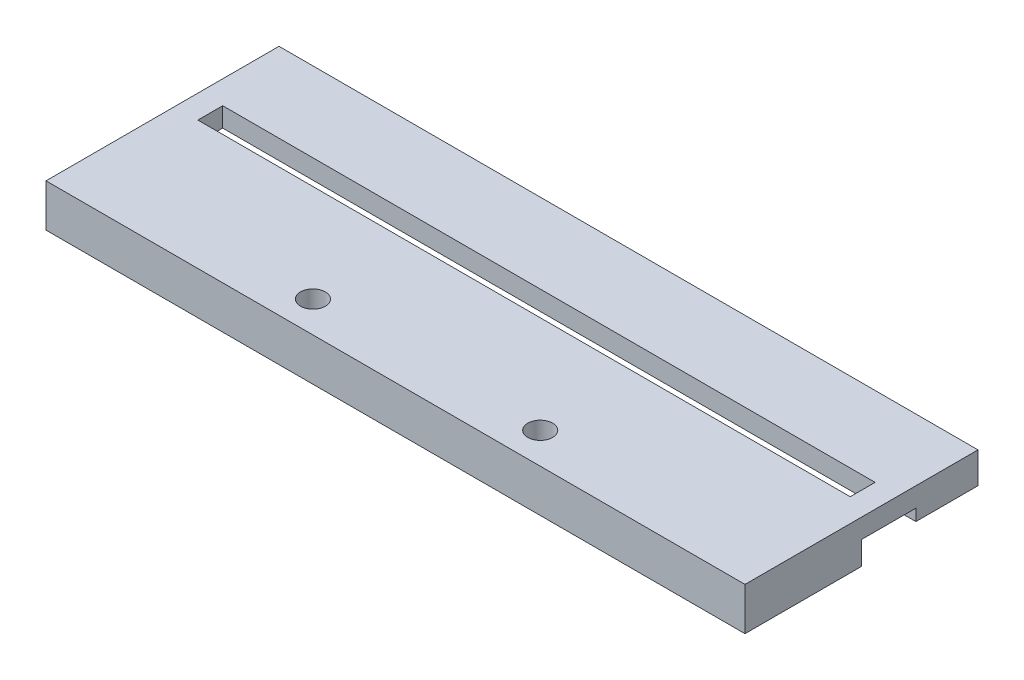
ISO-10303-21;
HEADER;
FILE_DESCRIPTION(('STEP AP214'),'2;1');
FILE_NAME('part.step','',(''),(''),'','','');
FILE_SCHEMA(('AUTOMOTIVE_DESIGN { 1 0 10303 214 1 1 1 1 }'));
ENDSEC;
DATA;
#1=APPLICATION_CONTEXT('core data for automotive mechanical design processes');
#2=APPLICATION_PROTOCOL_DEFINITION('international standard','automotive_design',2000,#1);
#3=PRODUCT_CONTEXT('',#1,'mechanical');
#4=PRODUCT('Part','Part','',(#3));
#5=PRODUCT_RELATED_PRODUCT_CATEGORY('part','',(#4));
#6=PRODUCT_DEFINITION_FORMATION('','',#4);
#7=PRODUCT_DEFINITION_CONTEXT('part definition',#1,'design');
#8=PRODUCT_DEFINITION('design','',#6,#7);
#9=PRODUCT_DEFINITION_SHAPE('','',#8);
#10=(LENGTH_UNIT() NAMED_UNIT(*) SI_UNIT(.MILLI.,.METRE.));
#11=(NAMED_UNIT(*) PLANE_ANGLE_UNIT() SI_UNIT($,.RADIAN.));
#12=(NAMED_UNIT(*) SI_UNIT($,.STERADIAN.) SOLID_ANGLE_UNIT());
#13=UNCERTAINTY_MEASURE_WITH_UNIT(LENGTH_MEASURE(1.E-05),#10,'distance_accuracy_value','');
#14=(GEOMETRIC_REPRESENTATION_CONTEXT(3) GLOBAL_UNCERTAINTY_ASSIGNED_CONTEXT((#13)) GLOBAL_UNIT_ASSIGNED_CONTEXT((#10,
#11,#12)) REPRESENTATION_CONTEXT('',''));
#15=CARTESIAN_POINT('',(0.,0.,0.));
#16=DIRECTION('',(0.,0.,1.));
#17=DIRECTION('',(1.,0.,0.));
#18=AXIS2_PLACEMENT_3D('',#15,#16,#17);
#19=CARTESIAN_POINT('',(0.,1.5,0.));
#20=DIRECTION('',(0.,1.,0.));
#21=DIRECTION('',(0.,0.,1.));
#22=AXIS2_PLACEMENT_3D('',#19,#20,#21);
#23=PLANE('',#22);
#24=DIRECTION('',(0.,0.,-1.));
#25=VECTOR('',#24,1.);
#26=CARTESIAN_POINT('',(-45.,1.5,-10.));
#27=LINE('',#26,#25);
#28=CARTESIAN_POINT('',(-45.,1.50000000000003,-7.));
#29=VERTEX_POINT('',#28);
#30=CARTESIAN_POINT('',(-45.,1.5,-15.));
#31=VERTEX_POINT('',#30);
#32=EDGE_CURVE('E283',#29,#31,#27,.T.);
#33=ORIENTED_EDGE('',*,*,#32,.T.);
#34=DIRECTION('',(1.,0.,0.));
#35=VECTOR('',#34,1.);
#36=CARTESIAN_POINT('',(45.,1.5,-15.));
#37=LINE('',#36,#35);
#38=CARTESIAN_POINT('',(-42.5,1.5,-15.));
#39=VERTEX_POINT('',#38);
#40=EDGE_CURVE('E202',#31,#39,#37,.T.);
#41=ORIENTED_EDGE('',*,*,#40,.T.);
#42=DIRECTION('',(0.,0.,1.));
#43=VECTOR('',#42,1.);
#44=CARTESIAN_POINT('',(-42.5,1.5,0.));
#45=LINE('',#44,#43);
#46=CARTESIAN_POINT('',(-42.5,1.5,-7.));
#47=VERTEX_POINT('',#46);
#48=EDGE_CURVE('E11',#39,#47,#45,.T.);
#49=ORIENTED_EDGE('',*,*,#48,.T.);
#50=DIRECTION('',(-1.,0.,0.));
#51=VECTOR('',#50,1.);
#52=CARTESIAN_POINT('',(-45.,1.5,-7.));
#53=LINE('',#52,#51);
#54=EDGE_CURVE('E280',#47,#29,#53,.T.);
#55=ORIENTED_EDGE('',*,*,#54,.T.);
#56=EDGE_LOOP('',(#33,#41,#49,#55));
#57=FACE_BOUND('',#56,.T.);
#58=ADVANCED_FACE('F39',(#57),#23,.F.);
#59=CARTESIAN_POINT('',(45.,5.5,15.));
#60=DIRECTION('',(-1.,0.,0.));
#61=DIRECTION('',(0.,0.,1.));
#62=AXIS2_PLACEMENT_3D('',#59,#60,#61);
#63=PLANE('',#62);
#64=DIRECTION('',(0.,0.,1.));
#65=VECTOR('',#64,1.);
#66=CARTESIAN_POINT('',(45.,3.,0.));
#67=LINE('',#66,#65);
#68=CARTESIAN_POINT('',(45.,3.00000000000003,-7.));
#69=VERTEX_POINT('',#68);
#70=CARTESIAN_POINT('',(45.,3.,0.));
#71=VERTEX_POINT('',#70);
#72=EDGE_CURVE('E159',#69,#71,#67,.T.);
#73=ORIENTED_EDGE('',*,*,#72,.F.);
#74=DIRECTION('',(0.,-1.,0.));
#75=VECTOR('',#74,1.);
#76=CARTESIAN_POINT('',(45.,93.27181176868,-7.));
#77=LINE('',#76,#75);
#78=CARTESIAN_POINT('',(45.,1.50000000000003,-7.));
#79=VERTEX_POINT('',#78);
#80=EDGE_CURVE('E170',#69,#79,#77,.T.);
#81=ORIENTED_EDGE('',*,*,#80,.T.);
#82=DIRECTION('',(0.,0.,1.));
#83=VECTOR('',#82,1.);
#84=CARTESIAN_POINT('',(45.,1.5,-10.));
#85=LINE('',#84,#83);
#86=CARTESIAN_POINT('',(45.,1.5,-15.));
#87=VERTEX_POINT('',#86);
#88=EDGE_CURVE('E275',#87,#79,#85,.T.);
#89=ORIENTED_EDGE('',*,*,#88,.F.);
#90=DIRECTION('',(0.,-1.,0.));
#91=VECTOR('',#90,1.);
#92=CARTESIAN_POINT('',(45.,5.5,-15.));
#93=LINE('',#92,#91);
#94=CARTESIAN_POINT('',(45.,5.5,-15.));
#95=VERTEX_POINT('',#94);
#96=EDGE_CURVE('E320',#95,#87,#93,.T.);
#97=ORIENTED_EDGE('',*,*,#96,.F.);
#98=DIRECTION('',(0.,0.,-1.));
#99=VECTOR('',#98,1.);
#100=CARTESIAN_POINT('',(45.,5.5,15.));
#101=LINE('',#100,#99);
#102=CARTESIAN_POINT('',(45.,5.5,15.));
#103=VERTEX_POINT('',#102);
#104=EDGE_CURVE('E287',#103,#95,#101,.T.);
#105=ORIENTED_EDGE('',*,*,#104,.F.);
#106=DIRECTION('',(0.,-1.,0.));
#107=VECTOR('',#106,1.);
#108=CARTESIAN_POINT('',(45.,5.5,15.));
#109=LINE('',#108,#107);
#110=CARTESIAN_POINT('',(45.,0.,15.));
#111=VERTEX_POINT('',#110);
#112=EDGE_CURVE('E301',#103,#111,#109,.T.);
#113=ORIENTED_EDGE('',*,*,#112,.T.);
#114=DIRECTION('',(0.,0.,-1.));
#115=VECTOR('',#114,1.);
#116=CARTESIAN_POINT('',(45.,0.,15.));
#117=LINE('',#116,#115);
#118=CARTESIAN_POINT('',(45.,0.,0.));
#119=VERTEX_POINT('',#118);
#120=EDGE_CURVE('E286',#111,#119,#117,.T.);
#121=ORIENTED_EDGE('',*,*,#120,.T.);
#122=DIRECTION('',(0.,-1.,0.));
#123=VECTOR('',#122,1.);
#124=CARTESIAN_POINT('',(45.,93.27181176868,0.));
#125=LINE('',#124,#123);
#126=EDGE_CURVE('E179',#71,#119,#125,.T.);
#127=ORIENTED_EDGE('',*,*,#126,.F.);
#128=EDGE_LOOP('',(#73,#81,#89,#97,#105,#113,#121,#127));
#129=FACE_BOUND('',#128,.T.);
#130=ADVANCED_FACE('F41',(#129),#63,.F.);
#131=CARTESIAN_POINT('',(-45.,5.5,-15.));
#132=DIRECTION('',(0.,0.,1.));
#133=DIRECTION('',(1.,0.,0.));
#134=AXIS2_PLACEMENT_3D('',#131,#132,#133);
#135=PLANE('',#134);
#136=ORIENTED_EDGE('',*,*,#96,.T.);
#137=CARTESIAN_POINT('',(42.5,1.5,-15.));
#138=VERTEX_POINT('',#137);
#139=EDGE_CURVE('E201',#138,#87,#37,.T.);
#140=ORIENTED_EDGE('',*,*,#139,.F.);
#141=DIRECTION('',(0.,-1.,0.));
#142=VECTOR('',#141,1.);
#143=CARTESIAN_POINT('',(42.5,1.5,-15.));
#144=LINE('',#143,#142);
#145=CARTESIAN_POINT('',(42.5,3.,-15.));
#146=VERTEX_POINT('',#145);
#147=EDGE_CURVE('E263',#146,#138,#144,.T.);
#148=ORIENTED_EDGE('',*,*,#147,.F.);
#149=DIRECTION('',(1.,0.,0.));
#150=VECTOR('',#149,1.);
#151=CARTESIAN_POINT('',(42.5,3.,-15.));
#152=LINE('',#151,#150);
#153=CARTESIAN_POINT('',(-42.5,3.,-15.));
#154=VERTEX_POINT('',#153);
#155=EDGE_CURVE('E267',#154,#146,#152,.T.);
#156=ORIENTED_EDGE('',*,*,#155,.F.);
#157=DIRECTION('',(0.,1.,0.));
#158=VECTOR('',#157,1.);
#159=CARTESIAN_POINT('',(-42.5,1.5,-15.));
#160=LINE('',#159,#158);
#161=EDGE_CURVE('E258',#39,#154,#160,.T.);
#162=ORIENTED_EDGE('',*,*,#161,.F.);
#163=ORIENTED_EDGE('',*,*,#40,.F.);
#164=DIRECTION('',(0.,-1.,0.));
#165=VECTOR('',#164,1.);
#166=CARTESIAN_POINT('',(-45.,5.5,-15.));
#167=LINE('',#166,#165);
#168=CARTESIAN_POINT('',(-45.,5.5,-15.));
#169=VERTEX_POINT('',#168);
#170=EDGE_CURVE('E316',#169,#31,#167,.T.);
#171=ORIENTED_EDGE('',*,*,#170,.F.);
#172=DIRECTION('',(-1.,0.,0.));
#173=VECTOR('',#172,1.);
#174=CARTESIAN_POINT('',(-45.,5.5,-15.));
#175=LINE('',#174,#173);
#176=EDGE_CURVE('E291',#95,#169,#175,.T.);
#177=ORIENTED_EDGE('',*,*,#176,.F.);
#178=EDGE_LOOP('',(#136,#140,#148,#156,#162,#163,#171,#177));
#179=FACE_BOUND('',#178,.T.);
#180=ADVANCED_FACE('F332',(#179),#135,.F.);
#181=CARTESIAN_POINT('',(-45.,5.5,15.));
#182=DIRECTION('',(1.,0.,0.));
#183=DIRECTION('',(0.,0.,-1.));
#184=AXIS2_PLACEMENT_3D('',#181,#182,#183);
#185=PLANE('',#184);
#186=ORIENTED_EDGE('',*,*,#32,.F.);
#187=DIRECTION('',(0.,-1.,0.));
#188=VECTOR('',#187,1.);
#189=CARTESIAN_POINT('',(-45.,93.27181176868,-7.));
#190=LINE('',#189,#188);
#191=CARTESIAN_POINT('',(-45.,3.,-7.));
#192=VERTEX_POINT('',#191);
#193=EDGE_CURVE('E191',#192,#29,#190,.T.);
#194=ORIENTED_EDGE('',*,*,#193,.F.);
#195=DIRECTION('',(0.,0.,-1.));
#196=VECTOR('',#195,1.);
#197=CARTESIAN_POINT('',(-45.,3.,0.));
#198=LINE('',#197,#196);
#199=CARTESIAN_POINT('',(-45.,3.,0.));
#200=VERTEX_POINT('',#199);
#201=EDGE_CURVE('E187',#200,#192,#198,.T.);
#202=ORIENTED_EDGE('',*,*,#201,.F.);
#203=DIRECTION('',(0.,-1.,0.));
#204=VECTOR('',#203,1.);
#205=CARTESIAN_POINT('',(-45.,93.27181176868,0.));
#206=LINE('',#205,#204);
#207=CARTESIAN_POINT('',(-45.,0.,0.));
#208=VERTEX_POINT('',#207);
#209=EDGE_CURVE('E183',#200,#208,#206,.T.);
#210=ORIENTED_EDGE('',*,*,#209,.T.);
#211=DIRECTION('',(0.,0.,1.));
#212=VECTOR('',#211,1.);
#213=CARTESIAN_POINT('',(-45.,0.,15.));
#214=LINE('',#213,#212);
#215=CARTESIAN_POINT('',(-45.,0.,15.));
#216=VERTEX_POINT('',#215);
#217=EDGE_CURVE('E304',#208,#216,#214,.T.);
#218=ORIENTED_EDGE('',*,*,#217,.T.);
#219=DIRECTION('',(0.,-1.,0.));
#220=VECTOR('',#219,1.);
#221=CARTESIAN_POINT('',(-45.,5.5,15.));
#222=LINE('',#221,#220);
#223=CARTESIAN_POINT('',(-45.,5.5,15.));
#224=VERTEX_POINT('',#223);
#225=EDGE_CURVE('E312',#224,#216,#222,.T.);
#226=ORIENTED_EDGE('',*,*,#225,.F.);
#227=DIRECTION('',(0.,0.,1.));
#228=VECTOR('',#227,1.);
#229=CARTESIAN_POINT('',(-45.,5.5,15.));
#230=LINE('',#229,#228);
#231=EDGE_CURVE('E295',#169,#224,#230,.T.);
#232=ORIENTED_EDGE('',*,*,#231,.F.);
#233=ORIENTED_EDGE('',*,*,#170,.T.);
#234=EDGE_LOOP('',(#186,#194,#202,#210,#218,#226,#232,#233));
#235=FACE_BOUND('',#234,.T.);
#236=ADVANCED_FACE('F349',(#235),#185,.F.);
#237=CARTESIAN_POINT('',(-45.,5.5,15.));
#238=DIRECTION('',(0.,0.,-1.));
#239=DIRECTION('',(-1.,0.,0.));
#240=AXIS2_PLACEMENT_3D('',#237,#238,#239);
#241=PLANE('',#240);
#242=DIRECTION('',(1.,0.,0.));
#243=VECTOR('',#242,1.);
#244=CARTESIAN_POINT('',(-45.,0.,15.));
#245=LINE('',#244,#243);
#246=EDGE_CURVE('E292',#216,#111,#245,.T.);
#247=ORIENTED_EDGE('',*,*,#246,.T.);
#248=ORIENTED_EDGE('',*,*,#112,.F.);
#249=DIRECTION('',(1.,0.,0.));
#250=VECTOR('',#249,1.);
#251=CARTESIAN_POINT('',(-45.,5.5,15.));
#252=LINE('',#251,#250);
#253=EDGE_CURVE('E298',#224,#103,#252,.T.);
#254=ORIENTED_EDGE('',*,*,#253,.F.);
#255=ORIENTED_EDGE('',*,*,#225,.T.);
#256=EDGE_LOOP('',(#247,#248,#254,#255));
#257=FACE_BOUND('',#256,.T.);
#258=ADVANCED_FACE('F399',(#257),#241,.F.);
#259=CARTESIAN_POINT('',(0.,5.5,0.));
#260=DIRECTION('',(0.,-1.,0.));
#261=DIRECTION('',(0.,0.,-1.));
#262=AXIS2_PLACEMENT_3D('',#259,#260,#261);
#263=PLANE('',#262);
#264=CARTESIAN_POINT('',(-14.633,5.5,11.));
#265=DIRECTION('',(0.,1.,0.));
#266=DIRECTION('',(0.,0.,1.));
#267=AXIS2_PLACEMENT_3D('',#264,#265,#266);
#268=CIRCLE('',#267,1.6);
#269=CARTESIAN_POINT('',(-14.633,5.5,12.6));
#270=VERTEX_POINT('',#269);
#271=EDGE_CURVE('E211',#270,#270,#268,.T.);
#272=ORIENTED_EDGE('',*,*,#271,.F.);
#273=EDGE_LOOP('',(#272));
#274=FACE_BOUND('',#273,.T.);
#275=CARTESIAN_POINT('',(14.633,5.5,11.));
#276=DIRECTION('',(0.,1.,0.));
#277=DIRECTION('',(0.,0.,1.));
#278=AXIS2_PLACEMENT_3D('',#275,#276,#277);
#279=CIRCLE('',#278,1.6);
#280=CARTESIAN_POINT('',(14.633,5.5,12.6));
#281=VERTEX_POINT('',#280);
#282=EDGE_CURVE('E206',#281,#281,#279,.T.);
#283=ORIENTED_EDGE('',*,*,#282,.F.);
#284=EDGE_LOOP('',(#283));
#285=FACE_BOUND('',#284,.T.);
#286=DIRECTION('',(-1.,0.,0.));
#287=VECTOR('',#286,1.);
#288=CARTESIAN_POINT('',(-42.,5.5,-4.75));
#289=LINE('',#288,#287);
#290=CARTESIAN_POINT('',(42.,5.5,-4.75));
#291=VERTEX_POINT('',#290);
#292=CARTESIAN_POINT('',(-42.,5.5,-4.75));
#293=VERTEX_POINT('',#292);
#294=EDGE_CURVE('E235',#291,#293,#289,.T.);
#295=ORIENTED_EDGE('',*,*,#294,.F.);
#296=DIRECTION('',(0.,0.,-1.));
#297=VECTOR('',#296,1.);
#298=CARTESIAN_POINT('',(42.,5.5,-1.55));
#299=LINE('',#298,#297);
#300=CARTESIAN_POINT('',(42.,5.5,-1.55));
#301=VERTEX_POINT('',#300);
#302=EDGE_CURVE('E55',#301,#291,#299,.T.);
#303=ORIENTED_EDGE('',*,*,#302,.F.);
#304=DIRECTION('',(1.,0.,0.));
#305=VECTOR('',#304,1.);
#306=CARTESIAN_POINT('',(-42.,5.5,-1.55));
#307=LINE('',#306,#305);
#308=CARTESIAN_POINT('',(-42.,5.5,-1.55));
#309=VERTEX_POINT('',#308);
#310=EDGE_CURVE('E242',#309,#301,#307,.T.);
#311=ORIENTED_EDGE('',*,*,#310,.F.);
#312=DIRECTION('',(0.,0.,1.));
#313=VECTOR('',#312,1.);
#314=CARTESIAN_POINT('',(-42.,5.5,-1.55));
#315=LINE('',#314,#313);
#316=EDGE_CURVE('E238',#293,#309,#315,.T.);
#317=ORIENTED_EDGE('',*,*,#316,.F.);
#318=EDGE_LOOP('',(#295,#303,#311,#317));
#319=FACE_BOUND('',#318,.T.);
#320=ORIENTED_EDGE('',*,*,#104,.T.);
#321=ORIENTED_EDGE('',*,*,#176,.T.);
#322=ORIENTED_EDGE('',*,*,#231,.T.);
#323=ORIENTED_EDGE('',*,*,#253,.T.);
#324=EDGE_LOOP('',(#320,#321,#322,#323));
#325=FACE_BOUND('',#324,.T.);
#326=ADVANCED_FACE('F355',(#274,#285,#319,#325),#263,.F.);
#327=CARTESIAN_POINT('',(0.,0.,0.));
#328=DIRECTION('',(0.,-1.,0.));
#329=DIRECTION('',(0.,0.,-1.));
#330=AXIS2_PLACEMENT_3D('',#327,#328,#329);
#331=PLANE('',#330);
#332=DIRECTION('',(-1.,0.,0.));
#333=VECTOR('',#332,1.);
#334=CARTESIAN_POINT('',(45.,0.,0.));
#335=LINE('',#334,#333);
#336=EDGE_CURVE('E167',#119,#208,#335,.T.);
#337=ORIENTED_EDGE('',*,*,#336,.F.);
#338=ORIENTED_EDGE('',*,*,#120,.F.);
#339=ORIENTED_EDGE('',*,*,#246,.F.);
#340=ORIENTED_EDGE('',*,*,#217,.F.);
#341=EDGE_LOOP('',(#337,#338,#339,#340));
#342=FACE_BOUND('',#341,.T.);
#343=CARTESIAN_POINT('',(-14.633,0.,11.));
#344=DIRECTION('',(0.,1.,0.));
#345=DIRECTION('',(0.,0.,1.));
#346=AXIS2_PLACEMENT_3D('',#343,#344,#345);
#347=CIRCLE('',#346,1.6);
#348=CARTESIAN_POINT('',(-14.633,0.,12.6));
#349=VERTEX_POINT('',#348);
#350=EDGE_CURVE('E207',#349,#349,#347,.T.);
#351=ORIENTED_EDGE('',*,*,#350,.T.);
#352=EDGE_LOOP('',(#351));
#353=FACE_BOUND('',#352,.T.);
#354=CARTESIAN_POINT('',(14.633,0.,11.));
#355=DIRECTION('',(0.,1.,0.));
#356=DIRECTION('',(0.,0.,1.));
#357=AXIS2_PLACEMENT_3D('',#354,#355,#356);
#358=CIRCLE('',#357,1.6);
#359=CARTESIAN_POINT('',(14.633,0.,12.6));
#360=VERTEX_POINT('',#359);
#361=EDGE_CURVE('E215',#360,#360,#358,.T.);
#362=ORIENTED_EDGE('',*,*,#361,.T.);
#363=EDGE_LOOP('',(#362));
#364=FACE_BOUND('',#363,.T.);
#365=ADVANCED_FACE('F363',(#342,#353,#364),#331,.T.);
#366=CARTESIAN_POINT('',(42.5,1.5,-7.));
#367=VERTEX_POINT('',#366);
#368=EDGE_CURVE('E173',#79,#367,#53,.T.);
#369=ORIENTED_EDGE('',*,*,#368,.T.);
#370=DIRECTION('',(0.,0.,-1.));
#371=VECTOR('',#370,1.);
#372=CARTESIAN_POINT('',(42.5,1.5,0.));
#373=LINE('',#372,#371);
#374=EDGE_CURVE('E48',#367,#138,#373,.T.);
#375=ORIENTED_EDGE('',*,*,#374,.T.);
#376=ORIENTED_EDGE('',*,*,#139,.T.);
#377=ORIENTED_EDGE('',*,*,#88,.T.);
#378=EDGE_LOOP('',(#369,#375,#376,#377));
#379=FACE_BOUND('',#378,.T.);
#380=ADVANCED_FACE('F328',(#379),#23,.F.);
#381=CARTESIAN_POINT('',(-42.5,1.5,0.));
#382=DIRECTION('',(-1.,0.,0.));
#383=DIRECTION('',(0.,0.,1.));
#384=AXIS2_PLACEMENT_3D('',#381,#382,#383);
#385=PLANE('',#384);
#386=DIRECTION('',(0.,0.,-1.));
#387=VECTOR('',#386,1.);
#388=CARTESIAN_POINT('',(-42.5,3.,0.));
#389=LINE('',#388,#387);
#390=CARTESIAN_POINT('',(-42.5,3.,-7.));
#391=VERTEX_POINT('',#390);
#392=EDGE_CURVE('E262',#391,#154,#389,.T.);
#393=ORIENTED_EDGE('',*,*,#392,.F.);
#394=DIRECTION('',(0.,-1.,0.));
#395=VECTOR('',#394,1.);
#396=CARTESIAN_POINT('',(-42.5,1.5,-7.));
#397=LINE('',#396,#395);
#398=EDGE_CURVE('E197',#391,#47,#397,.T.);
#399=ORIENTED_EDGE('',*,*,#398,.T.);
#400=ORIENTED_EDGE('',*,*,#48,.F.);
#401=ORIENTED_EDGE('',*,*,#161,.T.);
#402=EDGE_LOOP('',(#393,#399,#400,#401));
#403=FACE_BOUND('',#402,.T.);
#404=ADVANCED_FACE('F343',(#403),#385,.F.);
#405=CARTESIAN_POINT('',(42.5,1.5,0.));
#406=DIRECTION('',(1.,0.,0.));
#407=DIRECTION('',(0.,0.,-1.));
#408=AXIS2_PLACEMENT_3D('',#405,#406,#407);
#409=PLANE('',#408);
#410=ORIENTED_EDGE('',*,*,#374,.F.);
#411=DIRECTION('',(0.,1.,0.));
#412=VECTOR('',#411,1.);
#413=CARTESIAN_POINT('',(42.5,1.5,-7.));
#414=LINE('',#413,#412);
#415=CARTESIAN_POINT('',(42.5,3.,-7.));
#416=VERTEX_POINT('',#415);
#417=EDGE_CURVE('E194',#367,#416,#414,.T.);
#418=ORIENTED_EDGE('',*,*,#417,.T.);
#419=DIRECTION('',(0.,0.,-1.));
#420=VECTOR('',#419,1.);
#421=CARTESIAN_POINT('',(42.5,3.,0.));
#422=LINE('',#421,#420);
#423=EDGE_CURVE('E162',#416,#146,#422,.T.);
#424=ORIENTED_EDGE('',*,*,#423,.T.);
#425=ORIENTED_EDGE('',*,*,#147,.T.);
#426=EDGE_LOOP('',(#410,#418,#424,#425));
#427=FACE_BOUND('',#426,.T.);
#428=ADVANCED_FACE('F336',(#427),#409,.F.);
#429=CARTESIAN_POINT('',(42.5,3.,0.));
#430=DIRECTION('',(0.,1.,0.));
#431=DIRECTION('',(0.,0.,1.));
#432=AXIS2_PLACEMENT_3D('',#429,#430,#431);
#433=PLANE('',#432);
#434=ORIENTED_EDGE('',*,*,#423,.F.);
#435=DIRECTION('',(1.,0.,0.));
#436=VECTOR('',#435,1.);
#437=CARTESIAN_POINT('',(45.,3.,-7.));
#438=LINE('',#437,#436);
#439=EDGE_CURVE('E154',#416,#69,#438,.T.);
#440=ORIENTED_EDGE('',*,*,#439,.T.);
#441=ORIENTED_EDGE('',*,*,#72,.T.);
#442=DIRECTION('',(1.,0.,0.));
#443=VECTOR('',#442,1.);
#444=CARTESIAN_POINT('',(42.5,3.,0.));
#445=LINE('',#444,#443);
#446=EDGE_CURVE('E259',#200,#71,#445,.T.);
#447=ORIENTED_EDGE('',*,*,#446,.F.);
#448=ORIENTED_EDGE('',*,*,#201,.T.);
#449=EDGE_CURVE('E166',#192,#391,#438,.T.);
#450=ORIENTED_EDGE('',*,*,#449,.T.);
#451=ORIENTED_EDGE('',*,*,#392,.T.);
#452=ORIENTED_EDGE('',*,*,#155,.T.);
#453=EDGE_LOOP('',(#434,#440,#441,#447,#448,#450,#451,#452));
#454=FACE_BOUND('',#453,.T.);
#455=DIRECTION('',(-1.,0.,0.));
#456=VECTOR('',#455,1.);
#457=CARTESIAN_POINT('',(-42.,3.,-1.55));
#458=LINE('',#457,#456);
#459=CARTESIAN_POINT('',(42.,3.,-1.55));
#460=VERTEX_POINT('',#459);
#461=CARTESIAN_POINT('',(-42.,3.,-1.55));
#462=VERTEX_POINT('',#461);
#463=EDGE_CURVE('E225',#460,#462,#458,.T.);
#464=ORIENTED_EDGE('',*,*,#463,.F.);
#465=DIRECTION('',(0.,0.,1.));
#466=VECTOR('',#465,1.);
#467=CARTESIAN_POINT('',(42.,3.,-1.55));
#468=LINE('',#467,#466);
#469=CARTESIAN_POINT('',(42.,3.,-4.75));
#470=VERTEX_POINT('',#469);
#471=EDGE_CURVE('E229',#470,#460,#468,.T.);
#472=ORIENTED_EDGE('',*,*,#471,.F.);
#473=DIRECTION('',(1.,0.,0.));
#474=VECTOR('',#473,1.);
#475=CARTESIAN_POINT('',(-42.,3.,-4.75));
#476=LINE('',#475,#474);
#477=CARTESIAN_POINT('',(-42.,3.,-4.75));
#478=VERTEX_POINT('',#477);
#479=EDGE_CURVE('E232',#478,#470,#476,.T.);
#480=ORIENTED_EDGE('',*,*,#479,.F.);
#481=DIRECTION('',(0.,0.,-1.));
#482=VECTOR('',#481,1.);
#483=CARTESIAN_POINT('',(-42.,3.,-1.55));
#484=LINE('',#483,#482);
#485=EDGE_CURVE('E222',#462,#478,#484,.T.);
#486=ORIENTED_EDGE('',*,*,#485,.F.);
#487=EDGE_LOOP('',(#464,#472,#480,#486));
#488=FACE_BOUND('',#487,.T.);
#489=ADVANCED_FACE('F156',(#454,#488),#433,.F.);
#490=CARTESIAN_POINT('',(0.,0.,0.));
#491=DIRECTION('',(0.,0.,1.));
#492=DIRECTION('',(1.,0.,0.));
#493=AXIS2_PLACEMENT_3D('',#490,#491,#492);
#494=PLANE('',#493);
#495=ORIENTED_EDGE('',*,*,#209,.F.);
#496=ORIENTED_EDGE('',*,*,#446,.T.);
#497=ORIENTED_EDGE('',*,*,#126,.T.);
#498=ORIENTED_EDGE('',*,*,#336,.T.);
#499=EDGE_LOOP('',(#495,#496,#497,#498));
#500=FACE_BOUND('',#499,.T.);
#501=ADVANCED_FACE('F462',(#500),#494,.F.);
#502=CARTESIAN_POINT('',(42.,-81.0609302827419,-1.55));
#503=DIRECTION('',(1.,0.,0.));
#504=DIRECTION('',(0.,0.,-1.));
#505=AXIS2_PLACEMENT_3D('',#502,#503,#504);
#506=PLANE('',#505);
#507=ORIENTED_EDGE('',*,*,#471,.T.);
#508=DIRECTION('',(0.,1.,0.));
#509=VECTOR('',#508,1.);
#510=CARTESIAN_POINT('',(42.,-81.0609302827419,-1.55));
#511=LINE('',#510,#509);
#512=EDGE_CURVE('E226',#460,#301,#511,.T.);
#513=ORIENTED_EDGE('',*,*,#512,.T.);
#514=ORIENTED_EDGE('',*,*,#302,.T.);
#515=DIRECTION('',(0.,1.,0.));
#516=VECTOR('',#515,1.);
#517=CARTESIAN_POINT('',(42.,-81.0609302827419,-4.75));
#518=LINE('',#517,#516);
#519=EDGE_CURVE('E246',#470,#291,#518,.T.);
#520=ORIENTED_EDGE('',*,*,#519,.F.);
#521=EDGE_LOOP('',(#507,#513,#514,#520));
#522=FACE_BOUND('',#521,.T.);
#523=ADVANCED_FACE('F469',(#522),#506,.F.);
#524=CARTESIAN_POINT('',(-42.,-81.0609302827419,-1.55));
#525=DIRECTION('',(0.,0.,1.));
#526=DIRECTION('',(1.,0.,0.));
#527=AXIS2_PLACEMENT_3D('',#524,#525,#526);
#528=PLANE('',#527);
#529=ORIENTED_EDGE('',*,*,#463,.T.);
#530=DIRECTION('',(0.,1.,0.));
#531=VECTOR('',#530,1.);
#532=CARTESIAN_POINT('',(-42.,-81.0609302827419,-1.55));
#533=LINE('',#532,#531);
#534=EDGE_CURVE('E249',#462,#309,#533,.T.);
#535=ORIENTED_EDGE('',*,*,#534,.T.);
#536=ORIENTED_EDGE('',*,*,#310,.T.);
#537=ORIENTED_EDGE('',*,*,#512,.F.);
#538=EDGE_LOOP('',(#529,#535,#536,#537));
#539=FACE_BOUND('',#538,.T.);
#540=ADVANCED_FACE('F532',(#539),#528,.F.);
#541=CARTESIAN_POINT('',(-42.,-81.0609302827419,-1.55));
#542=DIRECTION('',(-1.,0.,0.));
#543=DIRECTION('',(0.,0.,1.));
#544=AXIS2_PLACEMENT_3D('',#541,#542,#543);
#545=PLANE('',#544);
#546=ORIENTED_EDGE('',*,*,#485,.T.);
#547=DIRECTION('',(0.,1.,0.));
#548=VECTOR('',#547,1.);
#549=CARTESIAN_POINT('',(-42.,-81.0609302827419,-4.75));
#550=LINE('',#549,#548);
#551=EDGE_CURVE('E63',#478,#293,#550,.T.);
#552=ORIENTED_EDGE('',*,*,#551,.T.);
#553=ORIENTED_EDGE('',*,*,#316,.T.);
#554=ORIENTED_EDGE('',*,*,#534,.F.);
#555=EDGE_LOOP('',(#546,#552,#553,#554));
#556=FACE_BOUND('',#555,.T.);
#557=ADVANCED_FACE('F540',(#556),#545,.F.);
#558=CARTESIAN_POINT('',(-42.,-81.0609302827419,-4.75));
#559=DIRECTION('',(0.,0.,-1.));
#560=DIRECTION('',(-1.,0.,0.));
#561=AXIS2_PLACEMENT_3D('',#558,#559,#560);
#562=PLANE('',#561);
#563=ORIENTED_EDGE('',*,*,#479,.T.);
#564=ORIENTED_EDGE('',*,*,#519,.T.);
#565=ORIENTED_EDGE('',*,*,#294,.T.);
#566=ORIENTED_EDGE('',*,*,#551,.F.);
#567=EDGE_LOOP('',(#563,#564,#565,#566));
#568=FACE_BOUND('',#567,.T.);
#569=ADVANCED_FACE('F431',(#568),#562,.F.);
#570=CARTESIAN_POINT('',(14.633,0.,11.));
#571=DIRECTION('',(0.,1.,0.));
#572=DIRECTION('',(0.,0.,1.));
#573=AXIS2_PLACEMENT_3D('',#570,#571,#572);
#574=CYLINDRICAL_SURFACE('',#573,1.6);
#575=ORIENTED_EDGE('',*,*,#361,.F.);
#576=EDGE_LOOP('',(#575));
#577=FACE_BOUND('',#576,.T.);
#578=ORIENTED_EDGE('',*,*,#282,.T.);
#579=EDGE_LOOP('',(#578));
#580=FACE_BOUND('',#579,.T.);
#581=ADVANCED_FACE('F436',(#577,#580),#574,.F.);
#582=CARTESIAN_POINT('',(-14.633,0.,11.));
#583=DIRECTION('',(0.,1.,0.));
#584=DIRECTION('',(0.,0.,1.));
#585=AXIS2_PLACEMENT_3D('',#582,#583,#584);
#586=CYLINDRICAL_SURFACE('',#585,1.6);
#587=ORIENTED_EDGE('',*,*,#350,.F.);
#588=EDGE_LOOP('',(#587));
#589=FACE_BOUND('',#588,.T.);
#590=ORIENTED_EDGE('',*,*,#271,.T.);
#591=EDGE_LOOP('',(#590));
#592=FACE_BOUND('',#591,.T.);
#593=ADVANCED_FACE('F381',(#589,#592),#586,.F.);
#594=CARTESIAN_POINT('',(45.,93.27181176868,-7.));
#595=DIRECTION('',(0.,0.,-1.));
#596=DIRECTION('',(-1.,0.,0.));
#597=AXIS2_PLACEMENT_3D('',#594,#595,#596);
#598=PLANE('',#597);
#599=ORIENTED_EDGE('',*,*,#80,.F.);
#600=ORIENTED_EDGE('',*,*,#439,.F.);
#601=ORIENTED_EDGE('',*,*,#417,.F.);
#602=ORIENTED_EDGE('',*,*,#368,.F.);
#603=EDGE_LOOP('',(#599,#600,#601,#602));
#604=FACE_BOUND('',#603,.T.);
#605=ADVANCED_FACE('F171',(#604),#598,.F.);
#606=ORIENTED_EDGE('',*,*,#449,.F.);
#607=ORIENTED_EDGE('',*,*,#193,.T.);
#608=ORIENTED_EDGE('',*,*,#54,.F.);
#609=ORIENTED_EDGE('',*,*,#398,.F.);
#610=EDGE_LOOP('',(#606,#607,#608,#609));
#611=FACE_BOUND('',#610,.T.);
#612=ADVANCED_FACE('F373',(#611),#598,.F.);
#613=CLOSED_SHELL('',(#58,#130,#180,#236,#258,#326,#365,#380,#404,#428,#489,#501,#523,#540,#557,
#569,#581,#593,#605,#612));
#614=MANIFOLD_SOLID_BREP('B2',#613);
#615=ADVANCED_BREP_SHAPE_REPRESENTATION('',(#18,#614),#14);
#616=SHAPE_DEFINITION_REPRESENTATION(#9,#615);
ENDSEC;
END-ISO-10303-21;
